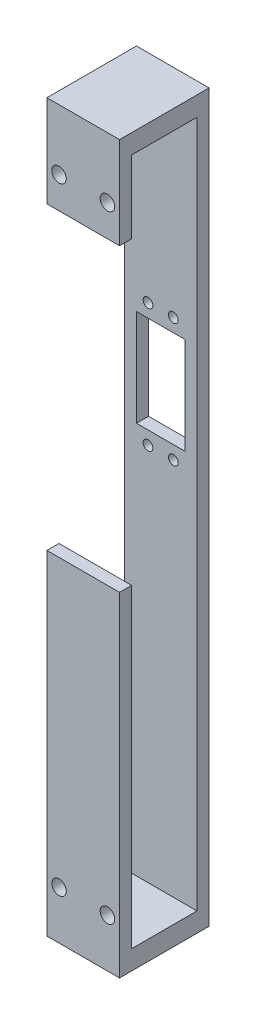
ISO-10303-21;
HEADER;
FILE_DESCRIPTION(('STEP AP214'),'2;1');
FILE_NAME('part.step','',(''),(''),'','','');
FILE_SCHEMA(('AUTOMOTIVE_DESIGN { 1 0 10303 214 1 1 1 1 }'));
ENDSEC;
DATA;
#1=APPLICATION_CONTEXT('core data for automotive mechanical design processes');
#2=APPLICATION_PROTOCOL_DEFINITION('international standard','automotive_design',2000,#1);
#3=PRODUCT_CONTEXT('',#1,'mechanical');
#4=PRODUCT('Part','Part','',(#3));
#5=PRODUCT_RELATED_PRODUCT_CATEGORY('part','',(#4));
#6=PRODUCT_DEFINITION_FORMATION('','',#4);
#7=PRODUCT_DEFINITION_CONTEXT('part definition',#1,'design');
#8=PRODUCT_DEFINITION('design','',#6,#7);
#9=PRODUCT_DEFINITION_SHAPE('','',#8);
#10=(LENGTH_UNIT() NAMED_UNIT(*) SI_UNIT(.MILLI.,.METRE.));
#11=(NAMED_UNIT(*) PLANE_ANGLE_UNIT() SI_UNIT($,.RADIAN.));
#12=(NAMED_UNIT(*) SI_UNIT($,.STERADIAN.) SOLID_ANGLE_UNIT());
#13=UNCERTAINTY_MEASURE_WITH_UNIT(LENGTH_MEASURE(1.E-05),#10,'distance_accuracy_value','');
#14=(GEOMETRIC_REPRESENTATION_CONTEXT(3) GLOBAL_UNCERTAINTY_ASSIGNED_CONTEXT((#13)) GLOBAL_UNIT_ASSIGNED_CONTEXT((#10,
#11,#12)) REPRESENTATION_CONTEXT('',''));
#15=CARTESIAN_POINT('',(0.,0.,0.));
#16=DIRECTION('',(0.,0.,1.));
#17=DIRECTION('',(1.,0.,0.));
#18=AXIS2_PLACEMENT_3D('',#15,#16,#17);
#19=CARTESIAN_POINT('',(0.,0.,37.));
#20=DIRECTION('',(0.,0.,1.));
#21=DIRECTION('',(1.,0.,0.));
#22=AXIS2_PLACEMENT_3D('',#19,#20,#21);
#23=PLANE('',#22);
#24=DIRECTION('',(0.,-1.,0.));
#25=VECTOR('',#24,1.);
#26=CARTESIAN_POINT('',(-4.99999999999999,-102.,37.));
#27=LINE('',#26,#25);
#28=CARTESIAN_POINT('',(-4.99999999999998,-72.,37.));
#29=VERTEX_POINT('',#28);
#30=CARTESIAN_POINT('',(-5.,-210.,37.));
#31=VERTEX_POINT('',#30);
#32=EDGE_CURVE('E257',#29,#31,#27,.T.);
#33=ORIENTED_EDGE('',*,*,#32,.T.);
#34=DIRECTION('',(-1.,0.,0.));
#35=VECTOR('',#34,1.);
#36=CARTESIAN_POINT('',(25.,-210.,37.));
#37=LINE('',#36,#35);
#38=CARTESIAN_POINT('',(25.,-210.,37.));
#39=VERTEX_POINT('',#38);
#40=EDGE_CURVE('E209',#39,#31,#37,.T.);
#41=ORIENTED_EDGE('',*,*,#40,.F.);
#42=DIRECTION('',(0.,1.,0.));
#43=VECTOR('',#42,1.);
#44=CARTESIAN_POINT('',(25.,-110.,37.));
#45=LINE('',#44,#43);
#46=CARTESIAN_POINT('',(25.,-72.,37.));
#47=VERTEX_POINT('',#46);
#48=EDGE_CURVE('E255',#39,#47,#45,.T.);
#49=ORIENTED_EDGE('',*,*,#48,.T.);
#50=DIRECTION('',(1.,0.,0.));
#51=VECTOR('',#50,1.);
#52=CARTESIAN_POINT('',(0.,-72.,37.));
#53=LINE('',#52,#51);
#54=EDGE_CURVE('E171',#29,#47,#53,.T.);
#55=ORIENTED_EDGE('',*,*,#54,.F.);
#56=EDGE_LOOP('',(#33,#41,#49,#55));
#57=FACE_BOUND('',#56,.T.);
#58=CARTESIAN_POINT('',(20.,-190.,37.));
#59=DIRECTION('',(0.,0.,1.));
#60=DIRECTION('',(1.,0.,0.));
#61=AXIS2_PLACEMENT_3D('',#58,#59,#60);
#62=CIRCLE('',#61,3.);
#63=CARTESIAN_POINT('',(23.,-190.,37.));
#64=VERTEX_POINT('',#63);
#65=EDGE_CURVE('E190',#64,#64,#62,.T.);
#66=ORIENTED_EDGE('',*,*,#65,.F.);
#67=EDGE_LOOP('',(#66));
#68=FACE_BOUND('',#67,.T.);
#69=CARTESIAN_POINT('',(0.,-190.,37.));
#70=DIRECTION('',(0.,0.,1.));
#71=DIRECTION('',(1.,0.,0.));
#72=AXIS2_PLACEMENT_3D('',#69,#70,#71);
#73=CIRCLE('',#72,3.);
#74=CARTESIAN_POINT('',(3.,-190.,37.));
#75=VERTEX_POINT('',#74);
#76=EDGE_CURVE('E326',#75,#75,#73,.F.);
#77=ORIENTED_EDGE('',*,*,#76,.T.);
#78=EDGE_LOOP('',(#77));
#79=FACE_BOUND('',#78,.T.);
#80=ADVANCED_FACE('F44',(#57,#68,#79),#23,.T.);
#81=CARTESIAN_POINT('',(0.,-72.,32.));
#82=DIRECTION('',(0.,0.,1.));
#83=DIRECTION('',(1.,0.,0.));
#84=AXIS2_PLACEMENT_3D('',#81,#82,#83);
#85=PLANE('',#84);
#86=CARTESIAN_POINT('',(20.,-190.,32.));
#87=DIRECTION('',(0.,0.,1.));
#88=DIRECTION('',(1.,0.,0.));
#89=AXIS2_PLACEMENT_3D('',#86,#87,#88);
#90=CIRCLE('',#89,3.);
#91=CARTESIAN_POINT('',(23.,-190.,32.));
#92=VERTEX_POINT('',#91);
#93=EDGE_CURVE('E324',#92,#92,#90,.T.);
#94=ORIENTED_EDGE('',*,*,#93,.T.);
#95=EDGE_LOOP('',(#94));
#96=FACE_BOUND('',#95,.T.);
#97=DIRECTION('',(0.,-1.,0.));
#98=VECTOR('',#97,1.);
#99=CARTESIAN_POINT('',(25.,-72.,32.));
#100=LINE('',#99,#98);
#101=CARTESIAN_POINT('',(25.,-72.,32.));
#102=VERTEX_POINT('',#101);
#103=CARTESIAN_POINT('',(25.,-202.,32.));
#104=VERTEX_POINT('',#103);
#105=EDGE_CURVE('E170',#102,#104,#100,.T.);
#106=ORIENTED_EDGE('',*,*,#105,.T.);
#107=DIRECTION('',(1.,0.,0.));
#108=VECTOR('',#107,1.);
#109=CARTESIAN_POINT('',(-5.,-202.,32.));
#110=LINE('',#109,#108);
#111=CARTESIAN_POINT('',(-5.,-202.,32.));
#112=VERTEX_POINT('',#111);
#113=EDGE_CURVE('E174',#112,#104,#110,.T.);
#114=ORIENTED_EDGE('',*,*,#113,.F.);
#115=DIRECTION('',(0.,-1.,0.));
#116=VECTOR('',#115,1.);
#117=CARTESIAN_POINT('',(-4.99999999999999,-72.,32.));
#118=LINE('',#117,#116);
#119=CARTESIAN_POINT('',(-4.99999999999999,-72.,32.));
#120=VERTEX_POINT('',#119);
#121=EDGE_CURVE('E162',#120,#112,#118,.T.);
#122=ORIENTED_EDGE('',*,*,#121,.F.);
#123=DIRECTION('',(-1.,0.,0.));
#124=VECTOR('',#123,1.);
#125=CARTESIAN_POINT('',(0.,-72.,32.));
#126=LINE('',#125,#124);
#127=EDGE_CURVE('E234',#102,#120,#126,.T.);
#128=ORIENTED_EDGE('',*,*,#127,.F.);
#129=EDGE_LOOP('',(#106,#114,#122,#128));
#130=FACE_BOUND('',#129,.T.);
#131=CARTESIAN_POINT('',(0.,-190.,32.));
#132=DIRECTION('',(0.,0.,1.));
#133=DIRECTION('',(1.,0.,0.));
#134=AXIS2_PLACEMENT_3D('',#131,#132,#133);
#135=CIRCLE('',#134,3.);
#136=CARTESIAN_POINT('',(3.,-190.,32.));
#137=VERTEX_POINT('',#136);
#138=EDGE_CURVE('E48',#137,#137,#135,.F.);
#139=ORIENTED_EDGE('',*,*,#138,.F.);
#140=EDGE_LOOP('',(#139));
#141=FACE_BOUND('',#140,.T.);
#142=ADVANCED_FACE('F175',(#96,#130,#141),#85,.F.);
#143=CARTESIAN_POINT('',(0.,0.,37.));
#144=DIRECTION('',(0.,0.,1.));
#145=DIRECTION('',(1.,0.,0.));
#146=AXIS2_PLACEMENT_3D('',#143,#144,#145);
#147=PLANE('',#146);
#148=CARTESIAN_POINT('',(0.,65.,37.));
#149=DIRECTION('',(0.,0.,1.));
#150=DIRECTION('',(1.,0.,0.));
#151=AXIS2_PLACEMENT_3D('',#148,#149,#150);
#152=CIRCLE('',#151,3.);
#153=CARTESIAN_POINT('',(3.00000000000001,65.,37.));
#154=VERTEX_POINT('',#153);
#155=EDGE_CURVE('E195',#154,#154,#152,.F.);
#156=ORIENTED_EDGE('',*,*,#155,.T.);
#157=EDGE_LOOP('',(#156));
#158=FACE_BOUND('',#157,.T.);
#159=DIRECTION('',(0.,1.,0.));
#160=VECTOR('',#159,1.);
#161=CARTESIAN_POINT('',(25.,82.,37.));
#162=LINE('',#161,#160);
#163=CARTESIAN_POINT('',(25.,52.,37.));
#164=VERTEX_POINT('',#163);
#165=CARTESIAN_POINT('',(25.,90.,37.));
#166=VERTEX_POINT('',#165);
#167=EDGE_CURVE('E241',#164,#166,#162,.T.);
#168=ORIENTED_EDGE('',*,*,#167,.T.);
#169=DIRECTION('',(-1.,0.,0.));
#170=VECTOR('',#169,1.);
#171=CARTESIAN_POINT('',(25.,90.,37.));
#172=LINE('',#171,#170);
#173=CARTESIAN_POINT('',(-5.,90.,37.));
#174=VERTEX_POINT('',#173);
#175=EDGE_CURVE('E244',#166,#174,#172,.T.);
#176=ORIENTED_EDGE('',*,*,#175,.T.);
#177=DIRECTION('',(0.,-1.,0.));
#178=VECTOR('',#177,1.);
#179=CARTESIAN_POINT('',(-5.,90.,37.));
#180=LINE('',#179,#178);
#181=CARTESIAN_POINT('',(-4.99999999999999,52.,37.));
#182=VERTEX_POINT('',#181);
#183=EDGE_CURVE('E247',#174,#182,#180,.T.);
#184=ORIENTED_EDGE('',*,*,#183,.T.);
#185=DIRECTION('',(-1.,0.,0.));
#186=VECTOR('',#185,1.);
#187=CARTESIAN_POINT('',(-4.99999999999999,52.,37.));
#188=LINE('',#187,#186);
#189=EDGE_CURVE('E215',#164,#182,#188,.T.);
#190=ORIENTED_EDGE('',*,*,#189,.F.);
#191=EDGE_LOOP('',(#168,#176,#184,#190));
#192=FACE_BOUND('',#191,.T.);
#193=CARTESIAN_POINT('',(20.,65.,37.));
#194=DIRECTION('',(0.,0.,1.));
#195=DIRECTION('',(1.,0.,0.));
#196=AXIS2_PLACEMENT_3D('',#193,#194,#195);
#197=CIRCLE('',#196,3.);
#198=CARTESIAN_POINT('',(23.,65.,37.));
#199=VERTEX_POINT('',#198);
#200=EDGE_CURVE('E199',#199,#199,#197,.T.);
#201=ORIENTED_EDGE('',*,*,#200,.F.);
#202=EDGE_LOOP('',(#201));
#203=FACE_BOUND('',#202,.T.);
#204=ADVANCED_FACE('F345',(#158,#192,#203),#147,.T.);
#205=CARTESIAN_POINT('',(25.,52.,32.));
#206=DIRECTION('',(0.,0.,1.));
#207=DIRECTION('',(1.,0.,0.));
#208=AXIS2_PLACEMENT_3D('',#205,#206,#207);
#209=PLANE('',#208);
#210=DIRECTION('',(1.,0.,0.));
#211=VECTOR('',#210,1.);
#212=CARTESIAN_POINT('',(25.,82.,32.));
#213=LINE('',#212,#211);
#214=CARTESIAN_POINT('',(-4.99999999999999,82.,32.));
#215=VERTEX_POINT('',#214);
#216=CARTESIAN_POINT('',(25.,82.,32.));
#217=VERTEX_POINT('',#216);
#218=EDGE_CURVE('E212',#215,#217,#213,.T.);
#219=ORIENTED_EDGE('',*,*,#218,.T.);
#220=DIRECTION('',(0.,1.,0.));
#221=VECTOR('',#220,1.);
#222=CARTESIAN_POINT('',(25.,52.,32.));
#223=LINE('',#222,#221);
#224=CARTESIAN_POINT('',(25.,52.,32.));
#225=VERTEX_POINT('',#224);
#226=EDGE_CURVE('E225',#225,#217,#223,.T.);
#227=ORIENTED_EDGE('',*,*,#226,.F.);
#228=DIRECTION('',(1.,0.,0.));
#229=VECTOR('',#228,1.);
#230=CARTESIAN_POINT('',(25.,52.,32.));
#231=LINE('',#230,#229);
#232=CARTESIAN_POINT('',(-4.99999999999999,52.,32.));
#233=VERTEX_POINT('',#232);
#234=EDGE_CURVE('E220',#233,#225,#231,.T.);
#235=ORIENTED_EDGE('',*,*,#234,.F.);
#236=DIRECTION('',(0.,1.,0.));
#237=VECTOR('',#236,1.);
#238=CARTESIAN_POINT('',(-4.99999999999999,52.,32.));
#239=LINE('',#238,#237);
#240=EDGE_CURVE('E229',#233,#215,#239,.T.);
#241=ORIENTED_EDGE('',*,*,#240,.T.);
#242=EDGE_LOOP('',(#219,#227,#235,#241));
#243=FACE_BOUND('',#242,.T.);
#244=CARTESIAN_POINT('',(0.,65.,32.));
#245=DIRECTION('',(0.,0.,1.));
#246=DIRECTION('',(1.,0.,0.));
#247=AXIS2_PLACEMENT_3D('',#244,#245,#246);
#248=CIRCLE('',#247,3.);
#249=CARTESIAN_POINT('',(3.00000000000001,65.,32.));
#250=VERTEX_POINT('',#249);
#251=EDGE_CURVE('E193',#250,#250,#248,.F.);
#252=ORIENTED_EDGE('',*,*,#251,.F.);
#253=EDGE_LOOP('',(#252));
#254=FACE_BOUND('',#253,.T.);
#255=CARTESIAN_POINT('',(20.,65.,32.));
#256=DIRECTION('',(0.,0.,1.));
#257=DIRECTION('',(1.,0.,0.));
#258=AXIS2_PLACEMENT_3D('',#255,#256,#257);
#259=CIRCLE('',#258,3.);
#260=CARTESIAN_POINT('',(23.,65.,32.));
#261=VERTEX_POINT('',#260);
#262=EDGE_CURVE('E198',#261,#261,#259,.T.);
#263=ORIENTED_EDGE('',*,*,#262,.T.);
#264=EDGE_LOOP('',(#263));
#265=FACE_BOUND('',#264,.T.);
#266=ADVANCED_FACE('F410',(#243,#254,#265),#209,.F.);
#267=CARTESIAN_POINT('',(-5.,82.,37.));
#268=DIRECTION('',(0.,1.,0.));
#269=DIRECTION('',(0.,0.,1.));
#270=AXIS2_PLACEMENT_3D('',#267,#268,#269);
#271=PLANE('',#270);
#272=ORIENTED_EDGE('',*,*,#218,.F.);
#273=DIRECTION('',(0.,0.,-1.));
#274=VECTOR('',#273,1.);
#275=CARTESIAN_POINT('',(-5.,82.,37.));
#276=LINE('',#275,#274);
#277=CARTESIAN_POINT('',(-5.,82.,5.));
#278=VERTEX_POINT('',#277);
#279=EDGE_CURVE('E253',#215,#278,#276,.T.);
#280=ORIENTED_EDGE('',*,*,#279,.T.);
#281=DIRECTION('',(1.,0.,0.));
#282=VECTOR('',#281,1.);
#283=CARTESIAN_POINT('',(-5.,82.,5.));
#284=LINE('',#283,#282);
#285=CARTESIAN_POINT('',(25.,82.,5.));
#286=VERTEX_POINT('',#285);
#287=EDGE_CURVE('E240',#278,#286,#284,.T.);
#288=ORIENTED_EDGE('',*,*,#287,.T.);
#289=DIRECTION('',(0.,0.,-1.));
#290=VECTOR('',#289,1.);
#291=CARTESIAN_POINT('',(25.,82.,37.));
#292=LINE('',#291,#290);
#293=EDGE_CURVE('E249',#217,#286,#292,.T.);
#294=ORIENTED_EDGE('',*,*,#293,.F.);
#295=EDGE_LOOP('',(#272,#280,#288,#294));
#296=FACE_BOUND('',#295,.T.);
#297=ADVANCED_FACE('F349',(#296),#271,.F.);
#298=CARTESIAN_POINT('',(0.,0.,5.));
#299=DIRECTION('',(0.,0.,-1.));
#300=DIRECTION('',(-1.,0.,0.));
#301=AXIS2_PLACEMENT_3D('',#298,#299,#300);
#302=PLANE('',#301);
#303=ORIENTED_EDGE('',*,*,#287,.F.);
#304=DIRECTION('',(0.,-1.,0.));
#305=VECTOR('',#304,1.);
#306=CARTESIAN_POINT('',(-5.,-50.,5.));
#307=LINE('',#306,#305);
#308=CARTESIAN_POINT('',(-5.,-202.,4.99999999999999));
#309=VERTEX_POINT('',#308);
#310=EDGE_CURVE('E53',#278,#309,#307,.T.);
#311=ORIENTED_EDGE('',*,*,#310,.T.);
#312=DIRECTION('',(1.,0.,0.));
#313=VECTOR('',#312,1.);
#314=CARTESIAN_POINT('',(-5.,-202.,4.99999999999999));
#315=LINE('',#314,#313);
#316=CARTESIAN_POINT('',(25.,-202.,4.99999999999999));
#317=VERTEX_POINT('',#316);
#318=EDGE_CURVE('E181',#309,#317,#315,.T.);
#319=ORIENTED_EDGE('',*,*,#318,.T.);
#320=DIRECTION('',(0.,1.,0.));
#321=VECTOR('',#320,1.);
#322=CARTESIAN_POINT('',(25.,10.,5.));
#323=LINE('',#322,#321);
#324=EDGE_CURVE('E12',#317,#286,#323,.T.);
#325=ORIENTED_EDGE('',*,*,#324,.T.);
#326=EDGE_LOOP('',(#303,#311,#319,#325));
#327=FACE_BOUND('',#326,.T.);
#328=CARTESIAN_POINT('',(4.74999999999999,-45.5,5.));
#329=DIRECTION('',(0.,0.,1.));
#330=DIRECTION('',(1.,0.,0.));
#331=AXIS2_PLACEMENT_3D('',#328,#329,#330);
#332=CIRCLE('',#331,1.99999999999994);
#333=CARTESIAN_POINT('',(6.74999999999993,-45.5,5.));
#334=VERTEX_POINT('',#333);
#335=EDGE_CURVE('E267',#334,#334,#332,.T.);
#336=ORIENTED_EDGE('',*,*,#335,.F.);
#337=EDGE_LOOP('',(#336));
#338=FACE_BOUND('',#337,.T.);
#339=CARTESIAN_POINT('',(15.25,-45.5,5.));
#340=DIRECTION('',(0.,0.,1.));
#341=DIRECTION('',(1.,0.,0.));
#342=AXIS2_PLACEMENT_3D('',#339,#340,#341);
#343=CIRCLE('',#342,1.99999999999994);
#344=CARTESIAN_POINT('',(17.2499999999999,-45.5,5.));
#345=VERTEX_POINT('',#344);
#346=EDGE_CURVE('E278',#345,#345,#343,.F.);
#347=ORIENTED_EDGE('',*,*,#346,.T.);
#348=EDGE_LOOP('',(#347));
#349=FACE_BOUND('',#348,.T.);
#350=DIRECTION('',(0.,-1.,0.));
#351=VECTOR('',#350,1.);
#352=CARTESIAN_POINT('',(0.,0.,5.));
#353=LINE('',#352,#351);
#354=CARTESIAN_POINT('',(0.,0.,5.));
#355=VERTEX_POINT('',#354);
#356=CARTESIAN_POINT('',(0.,-40.,5.));
#357=VERTEX_POINT('',#356);
#358=EDGE_CURVE('E291',#355,#357,#353,.T.);
#359=ORIENTED_EDGE('',*,*,#358,.F.);
#360=DIRECTION('',(-1.,0.,0.));
#361=VECTOR('',#360,1.);
#362=CARTESIAN_POINT('',(0.,0.,5.));
#363=LINE('',#362,#361);
#364=CARTESIAN_POINT('',(20.,0.,5.));
#365=VERTEX_POINT('',#364);
#366=EDGE_CURVE('E298',#365,#355,#363,.T.);
#367=ORIENTED_EDGE('',*,*,#366,.F.);
#368=DIRECTION('',(0.,1.,0.));
#369=VECTOR('',#368,1.);
#370=CARTESIAN_POINT('',(20.,0.,5.));
#371=LINE('',#370,#369);
#372=CARTESIAN_POINT('',(20.,-40.,5.));
#373=VERTEX_POINT('',#372);
#374=EDGE_CURVE('E296',#373,#365,#371,.T.);
#375=ORIENTED_EDGE('',*,*,#374,.F.);
#376=DIRECTION('',(1.,0.,0.));
#377=VECTOR('',#376,1.);
#378=CARTESIAN_POINT('',(0.,-40.,5.));
#379=LINE('',#378,#377);
#380=EDGE_CURVE('E293',#357,#373,#379,.T.);
#381=ORIENTED_EDGE('',*,*,#380,.F.);
#382=EDGE_LOOP('',(#359,#367,#375,#381));
#383=FACE_BOUND('',#382,.T.);
#384=CARTESIAN_POINT('',(4.75,5.5,5.));
#385=DIRECTION('',(0.,0.,1.));
#386=DIRECTION('',(1.,0.,0.));
#387=AXIS2_PLACEMENT_3D('',#384,#385,#386);
#388=CIRCLE('',#387,2.);
#389=CARTESIAN_POINT('',(6.75,5.5,5.));
#390=VERTEX_POINT('',#389);
#391=EDGE_CURVE('E271',#390,#390,#388,.F.);
#392=ORIENTED_EDGE('',*,*,#391,.T.);
#393=EDGE_LOOP('',(#392));
#394=FACE_BOUND('',#393,.T.);
#395=CARTESIAN_POINT('',(15.25,5.49999999999999,5.));
#396=DIRECTION('',(0.,0.,1.));
#397=DIRECTION('',(1.,0.,0.));
#398=AXIS2_PLACEMENT_3D('',#395,#396,#397);
#399=CIRCLE('',#398,2.);
#400=CARTESIAN_POINT('',(17.25,5.49999999999999,5.));
#401=VERTEX_POINT('',#400);
#402=EDGE_CURVE('E272',#401,#401,#399,.T.);
#403=ORIENTED_EDGE('',*,*,#402,.F.);
#404=EDGE_LOOP('',(#403));
#405=FACE_BOUND('',#404,.T.);
#406=ADVANCED_FACE('F387',(#327,#338,#349,#383,#394,#405),#302,.F.);
#407=CARTESIAN_POINT('',(-5.,-50.,5.));
#408=DIRECTION('',(1.,0.,0.));
#409=DIRECTION('',(0.,0.,-1.));
#410=AXIS2_PLACEMENT_3D('',#407,#408,#409);
#411=PLANE('',#410);
#412=DIRECTION('',(0.,0.,-1.));
#413=VECTOR('',#412,1.);
#414=CARTESIAN_POINT('',(-5.,-202.,4.99999999999999));
#415=LINE('',#414,#413);
#416=EDGE_CURVE('E166',#112,#309,#415,.T.);
#417=ORIENTED_EDGE('',*,*,#416,.T.);
#418=ORIENTED_EDGE('',*,*,#310,.F.);
#419=ORIENTED_EDGE('',*,*,#279,.F.);
#420=ORIENTED_EDGE('',*,*,#240,.F.);
#421=DIRECTION('',(0.,0.,-1.));
#422=VECTOR('',#421,1.);
#423=CARTESIAN_POINT('',(-4.99999999999999,52.,37.));
#424=LINE('',#423,#422);
#425=EDGE_CURVE('E218',#182,#233,#424,.T.);
#426=ORIENTED_EDGE('',*,*,#425,.F.);
#427=ORIENTED_EDGE('',*,*,#183,.F.);
#428=DIRECTION('',(0.,0.,1.));
#429=VECTOR('',#428,1.);
#430=CARTESIAN_POINT('',(-5.,90.,0.));
#431=LINE('',#430,#429);
#432=CARTESIAN_POINT('',(-5.,90.,0.));
#433=VERTEX_POINT('',#432);
#434=EDGE_CURVE('E262',#433,#174,#431,.T.);
#435=ORIENTED_EDGE('',*,*,#434,.F.);
#436=DIRECTION('',(0.,-1.,0.));
#437=VECTOR('',#436,1.);
#438=CARTESIAN_POINT('',(-5.,-50.,0.));
#439=LINE('',#438,#437);
#440=CARTESIAN_POINT('',(-5.,-210.,0.));
#441=VERTEX_POINT('',#440);
#442=EDGE_CURVE('E316',#433,#441,#439,.T.);
#443=ORIENTED_EDGE('',*,*,#442,.T.);
#444=DIRECTION('',(0.,0.,1.));
#445=VECTOR('',#444,1.);
#446=CARTESIAN_POINT('',(-5.,-210.,0.));
#447=LINE('',#446,#445);
#448=EDGE_CURVE('E202',#441,#31,#447,.T.);
#449=ORIENTED_EDGE('',*,*,#448,.T.);
#450=ORIENTED_EDGE('',*,*,#32,.F.);
#451=DIRECTION('',(0.,0.,1.));
#452=VECTOR('',#451,1.);
#453=CARTESIAN_POINT('',(-4.99999999999999,-72.,0.));
#454=LINE('',#453,#452);
#455=EDGE_CURVE('E168',#120,#29,#454,.T.);
#456=ORIENTED_EDGE('',*,*,#455,.F.);
#457=ORIENTED_EDGE('',*,*,#121,.T.);
#458=EDGE_LOOP('',(#417,#418,#419,#420,#426,#427,#435,#443,#449,#450,#456,#457));
#459=FACE_BOUND('',#458,.T.);
#460=ADVANCED_FACE('F46',(#459),#411,.F.);
#461=CARTESIAN_POINT('',(25.,10.,5.));
#462=DIRECTION('',(-1.,0.,0.));
#463=DIRECTION('',(0.,0.,1.));
#464=AXIS2_PLACEMENT_3D('',#461,#462,#463);
#465=PLANE('',#464);
#466=ORIENTED_EDGE('',*,*,#324,.F.);
#467=DIRECTION('',(0.,0.,-1.));
#468=VECTOR('',#467,1.);
#469=CARTESIAN_POINT('',(25.,-202.,4.99999999999999));
#470=LINE('',#469,#468);
#471=EDGE_CURVE('E186',#104,#317,#470,.T.);
#472=ORIENTED_EDGE('',*,*,#471,.F.);
#473=ORIENTED_EDGE('',*,*,#105,.F.);
#474=DIRECTION('',(0.,0.,-1.));
#475=VECTOR('',#474,1.);
#476=CARTESIAN_POINT('',(25.,-72.,0.));
#477=LINE('',#476,#475);
#478=EDGE_CURVE('E231',#47,#102,#477,.T.);
#479=ORIENTED_EDGE('',*,*,#478,.F.);
#480=ORIENTED_EDGE('',*,*,#48,.F.);
#481=DIRECTION('',(0.,0.,1.));
#482=VECTOR('',#481,1.);
#483=CARTESIAN_POINT('',(25.,-210.,0.));
#484=LINE('',#483,#482);
#485=CARTESIAN_POINT('',(25.,-210.,0.));
#486=VERTEX_POINT('',#485);
#487=EDGE_CURVE('E203',#486,#39,#484,.T.);
#488=ORIENTED_EDGE('',*,*,#487,.F.);
#489=DIRECTION('',(0.,1.,0.));
#490=VECTOR('',#489,1.);
#491=CARTESIAN_POINT('',(25.,10.,0.));
#492=LINE('',#491,#490);
#493=CARTESIAN_POINT('',(25.,90.,0.));
#494=VERTEX_POINT('',#493);
#495=EDGE_CURVE('E317',#486,#494,#492,.T.);
#496=ORIENTED_EDGE('',*,*,#495,.T.);
#497=DIRECTION('',(0.,0.,-1.));
#498=VECTOR('',#497,1.);
#499=CARTESIAN_POINT('',(25.,90.,5.));
#500=LINE('',#499,#498);
#501=EDGE_CURVE('E264',#166,#494,#500,.T.);
#502=ORIENTED_EDGE('',*,*,#501,.F.);
#503=ORIENTED_EDGE('',*,*,#167,.F.);
#504=DIRECTION('',(0.,0.,1.));
#505=VECTOR('',#504,1.);
#506=CARTESIAN_POINT('',(25.,52.,37.));
#507=LINE('',#506,#505);
#508=EDGE_CURVE('E222',#225,#164,#507,.T.);
#509=ORIENTED_EDGE('',*,*,#508,.F.);
#510=ORIENTED_EDGE('',*,*,#226,.T.);
#511=ORIENTED_EDGE('',*,*,#293,.T.);
#512=EDGE_LOOP('',(#466,#472,#473,#479,#480,#488,#496,#502,#503,#509,#510,#511));
#513=FACE_BOUND('',#512,.T.);
#514=ADVANCED_FACE('F392',(#513),#465,.F.);
#515=CARTESIAN_POINT('',(0.,0.,0.));
#516=DIRECTION('',(0.,0.,-1.));
#517=DIRECTION('',(-1.,0.,0.));
#518=AXIS2_PLACEMENT_3D('',#515,#516,#517);
#519=PLANE('',#518);
#520=ORIENTED_EDGE('',*,*,#442,.F.);
#521=DIRECTION('',(-1.,0.,0.));
#522=VECTOR('',#521,1.);
#523=CARTESIAN_POINT('',(25.,90.,0.));
#524=LINE('',#523,#522);
#525=EDGE_CURVE('E259',#494,#433,#524,.T.);
#526=ORIENTED_EDGE('',*,*,#525,.F.);
#527=ORIENTED_EDGE('',*,*,#495,.F.);
#528=DIRECTION('',(-1.,0.,0.));
#529=VECTOR('',#528,1.);
#530=CARTESIAN_POINT('',(25.,-210.,0.));
#531=LINE('',#530,#529);
#532=EDGE_CURVE('E206',#486,#441,#531,.T.);
#533=ORIENTED_EDGE('',*,*,#532,.T.);
#534=EDGE_LOOP('',(#520,#526,#527,#533));
#535=FACE_BOUND('',#534,.T.);
#536=CARTESIAN_POINT('',(15.25,-45.5,0.));
#537=DIRECTION('',(0.,0.,1.));
#538=DIRECTION('',(1.,0.,0.));
#539=AXIS2_PLACEMENT_3D('',#536,#537,#538);
#540=CIRCLE('',#539,1.99999999999994);
#541=CARTESIAN_POINT('',(17.2499999999999,-45.5,0.));
#542=VERTEX_POINT('',#541);
#543=EDGE_CURVE('E275',#542,#542,#540,.F.);
#544=ORIENTED_EDGE('',*,*,#543,.F.);
#545=EDGE_LOOP('',(#544));
#546=FACE_BOUND('',#545,.T.);
#547=CARTESIAN_POINT('',(4.75,5.5,0.));
#548=DIRECTION('',(0.,0.,1.));
#549=DIRECTION('',(1.,0.,0.));
#550=AXIS2_PLACEMENT_3D('',#547,#548,#549);
#551=CIRCLE('',#550,2.);
#552=CARTESIAN_POINT('',(6.75,5.5,0.));
#553=VERTEX_POINT('',#552);
#554=EDGE_CURVE('E286',#553,#553,#551,.F.);
#555=ORIENTED_EDGE('',*,*,#554,.F.);
#556=EDGE_LOOP('',(#555));
#557=FACE_BOUND('',#556,.T.);
#558=DIRECTION('',(-1.,0.,0.));
#559=VECTOR('',#558,1.);
#560=CARTESIAN_POINT('',(0.,0.,0.));
#561=LINE('',#560,#559);
#562=CARTESIAN_POINT('',(20.,0.,0.));
#563=VERTEX_POINT('',#562);
#564=CARTESIAN_POINT('',(0.,0.,0.));
#565=VERTEX_POINT('',#564);
#566=EDGE_CURVE('E294',#563,#565,#561,.T.);
#567=ORIENTED_EDGE('',*,*,#566,.T.);
#568=DIRECTION('',(0.,-1.,0.));
#569=VECTOR('',#568,1.);
#570=CARTESIAN_POINT('',(0.,0.,0.));
#571=LINE('',#570,#569);
#572=CARTESIAN_POINT('',(0.,-40.,0.));
#573=VERTEX_POINT('',#572);
#574=EDGE_CURVE('E69',#565,#573,#571,.T.);
#575=ORIENTED_EDGE('',*,*,#574,.T.);
#576=DIRECTION('',(1.,0.,0.));
#577=VECTOR('',#576,1.);
#578=CARTESIAN_POINT('',(0.,-40.,0.));
#579=LINE('',#578,#577);
#580=CARTESIAN_POINT('',(20.,-40.,0.));
#581=VERTEX_POINT('',#580);
#582=EDGE_CURVE('E302',#573,#581,#579,.T.);
#583=ORIENTED_EDGE('',*,*,#582,.T.);
#584=DIRECTION('',(0.,1.,0.));
#585=VECTOR('',#584,1.);
#586=CARTESIAN_POINT('',(20.,0.,0.));
#587=LINE('',#586,#585);
#588=EDGE_CURVE('E305',#581,#563,#587,.T.);
#589=ORIENTED_EDGE('',*,*,#588,.T.);
#590=EDGE_LOOP('',(#567,#575,#583,#589));
#591=FACE_BOUND('',#590,.T.);
#592=CARTESIAN_POINT('',(15.25,5.49999999999999,0.));
#593=DIRECTION('',(0.,0.,1.));
#594=DIRECTION('',(1.,0.,0.));
#595=AXIS2_PLACEMENT_3D('',#592,#593,#594);
#596=CIRCLE('',#595,2.);
#597=CARTESIAN_POINT('',(17.25,5.49999999999999,0.));
#598=VERTEX_POINT('',#597);
#599=EDGE_CURVE('E268',#598,#598,#596,.T.);
#600=ORIENTED_EDGE('',*,*,#599,.T.);
#601=EDGE_LOOP('',(#600));
#602=FACE_BOUND('',#601,.T.);
#603=CARTESIAN_POINT('',(4.74999999999999,-45.5,0.));
#604=DIRECTION('',(0.,0.,1.));
#605=DIRECTION('',(1.,0.,0.));
#606=AXIS2_PLACEMENT_3D('',#603,#604,#605);
#607=CIRCLE('',#606,1.99999999999994);
#608=CARTESIAN_POINT('',(6.74999999999993,-45.5,0.));
#609=VERTEX_POINT('',#608);
#610=EDGE_CURVE('E281',#609,#609,#607,.T.);
#611=ORIENTED_EDGE('',*,*,#610,.T.);
#612=EDGE_LOOP('',(#611));
#613=FACE_BOUND('',#612,.T.);
#614=ADVANCED_FACE('F386',(#535,#546,#557,#591,#602,#613),#519,.T.);
#615=CARTESIAN_POINT('',(0.,0.,5.));
#616=DIRECTION('',(1.,0.,0.));
#617=DIRECTION('',(0.,1.,0.));
#618=AXIS2_PLACEMENT_3D('',#615,#616,#617);
#619=PLANE('',#618);
#620=ORIENTED_EDGE('',*,*,#574,.F.);
#621=DIRECTION('',(0.,0.,-1.));
#622=VECTOR('',#621,1.);
#623=CARTESIAN_POINT('',(0.,0.,5.));
#624=LINE('',#623,#622);
#625=EDGE_CURVE('E300',#355,#565,#624,.T.);
#626=ORIENTED_EDGE('',*,*,#625,.F.);
#627=ORIENTED_EDGE('',*,*,#358,.T.);
#628=DIRECTION('',(0.,0.,-1.));
#629=VECTOR('',#628,1.);
#630=CARTESIAN_POINT('',(0.,-40.,5.));
#631=LINE('',#630,#629);
#632=EDGE_CURVE('E314',#357,#573,#631,.T.);
#633=ORIENTED_EDGE('',*,*,#632,.T.);
#634=EDGE_LOOP('',(#620,#626,#627,#633));
#635=FACE_BOUND('',#634,.T.);
#636=ADVANCED_FACE('F382',(#635),#619,.T.);
#637=CARTESIAN_POINT('',(0.,-40.,5.));
#638=DIRECTION('',(0.,1.,0.));
#639=DIRECTION('',(0.,0.,1.));
#640=AXIS2_PLACEMENT_3D('',#637,#638,#639);
#641=PLANE('',#640);
#642=ORIENTED_EDGE('',*,*,#582,.F.);
#643=ORIENTED_EDGE('',*,*,#632,.F.);
#644=ORIENTED_EDGE('',*,*,#380,.T.);
#645=DIRECTION('',(0.,0.,-1.));
#646=VECTOR('',#645,1.);
#647=CARTESIAN_POINT('',(20.,-40.,5.));
#648=LINE('',#647,#646);
#649=EDGE_CURVE('E312',#373,#581,#648,.T.);
#650=ORIENTED_EDGE('',*,*,#649,.T.);
#651=EDGE_LOOP('',(#642,#643,#644,#650));
#652=FACE_BOUND('',#651,.T.);
#653=ADVANCED_FACE('F378',(#652),#641,.T.);
#654=CARTESIAN_POINT('',(20.,0.,5.));
#655=DIRECTION('',(-1.,0.,0.));
#656=DIRECTION('',(0.,-1.,0.));
#657=AXIS2_PLACEMENT_3D('',#654,#655,#656);
#658=PLANE('',#657);
#659=ORIENTED_EDGE('',*,*,#588,.F.);
#660=ORIENTED_EDGE('',*,*,#649,.F.);
#661=ORIENTED_EDGE('',*,*,#374,.T.);
#662=DIRECTION('',(0.,0.,-1.));
#663=VECTOR('',#662,1.);
#664=CARTESIAN_POINT('',(20.,0.,5.));
#665=LINE('',#664,#663);
#666=EDGE_CURVE('E61',#365,#563,#665,.T.);
#667=ORIENTED_EDGE('',*,*,#666,.T.);
#668=EDGE_LOOP('',(#659,#660,#661,#667));
#669=FACE_BOUND('',#668,.T.);
#670=ADVANCED_FACE('F375',(#669),#658,.T.);
#671=CARTESIAN_POINT('',(0.,0.,5.));
#672=DIRECTION('',(0.,-1.,0.));
#673=DIRECTION('',(0.,0.,-1.));
#674=AXIS2_PLACEMENT_3D('',#671,#672,#673);
#675=PLANE('',#674);
#676=ORIENTED_EDGE('',*,*,#566,.F.);
#677=ORIENTED_EDGE('',*,*,#666,.F.);
#678=ORIENTED_EDGE('',*,*,#366,.T.);
#679=ORIENTED_EDGE('',*,*,#625,.T.);
#680=EDGE_LOOP('',(#676,#677,#678,#679));
#681=FACE_BOUND('',#680,.T.);
#682=ADVANCED_FACE('F371',(#681),#675,.T.);
#683=CARTESIAN_POINT('',(4.75,5.5,0.));
#684=DIRECTION('',(0.,0.,1.));
#685=DIRECTION('',(1.,0.,0.));
#686=AXIS2_PLACEMENT_3D('',#683,#684,#685);
#687=CYLINDRICAL_SURFACE('',#686,2.);
#688=ORIENTED_EDGE('',*,*,#554,.T.);
#689=EDGE_LOOP('',(#688));
#690=FACE_BOUND('',#689,.T.);
#691=ORIENTED_EDGE('',*,*,#391,.F.);
#692=EDGE_LOOP('',(#691));
#693=FACE_BOUND('',#692,.T.);
#694=ADVANCED_FACE('F361',(#690,#693),#687,.F.);
#695=CARTESIAN_POINT('',(15.25,5.49999999999999,0.));
#696=DIRECTION('',(0.,0.,1.));
#697=DIRECTION('',(1.,0.,0.));
#698=AXIS2_PLACEMENT_3D('',#695,#696,#697);
#699=CYLINDRICAL_SURFACE('',#698,2.);
#700=ORIENTED_EDGE('',*,*,#599,.F.);
#701=EDGE_LOOP('',(#700));
#702=FACE_BOUND('',#701,.T.);
#703=ORIENTED_EDGE('',*,*,#402,.T.);
#704=EDGE_LOOP('',(#703));
#705=FACE_BOUND('',#704,.T.);
#706=ADVANCED_FACE('F357',(#702,#705),#699,.F.);
#707=CARTESIAN_POINT('',(15.25,-45.5,0.));
#708=DIRECTION('',(0.,0.,1.));
#709=DIRECTION('',(1.,0.,0.));
#710=AXIS2_PLACEMENT_3D('',#707,#708,#709);
#711=CYLINDRICAL_SURFACE('',#710,1.99999999999994);
#712=ORIENTED_EDGE('',*,*,#543,.T.);
#713=EDGE_LOOP('',(#712));
#714=FACE_BOUND('',#713,.T.);
#715=ORIENTED_EDGE('',*,*,#346,.F.);
#716=EDGE_LOOP('',(#715));
#717=FACE_BOUND('',#716,.T.);
#718=ADVANCED_FACE('F360',(#714,#717),#711,.F.);
#719=CARTESIAN_POINT('',(4.74999999999999,-45.5,0.));
#720=DIRECTION('',(0.,0.,1.));
#721=DIRECTION('',(1.,0.,0.));
#722=AXIS2_PLACEMENT_3D('',#719,#720,#721);
#723=CYLINDRICAL_SURFACE('',#722,1.99999999999994);
#724=ORIENTED_EDGE('',*,*,#610,.F.);
#725=EDGE_LOOP('',(#724));
#726=FACE_BOUND('',#725,.T.);
#727=ORIENTED_EDGE('',*,*,#335,.T.);
#728=EDGE_LOOP('',(#727));
#729=FACE_BOUND('',#728,.T.);
#730=ADVANCED_FACE('F355',(#726,#729),#723,.F.);
#731=CARTESIAN_POINT('',(0.,90.,0.));
#732=DIRECTION('',(0.,1.,0.));
#733=DIRECTION('',(0.,0.,1.));
#734=AXIS2_PLACEMENT_3D('',#731,#732,#733);
#735=PLANE('',#734);
#736=ORIENTED_EDGE('',*,*,#525,.T.);
#737=ORIENTED_EDGE('',*,*,#434,.T.);
#738=ORIENTED_EDGE('',*,*,#175,.F.);
#739=ORIENTED_EDGE('',*,*,#501,.T.);
#740=EDGE_LOOP('',(#736,#737,#738,#739));
#741=FACE_BOUND('',#740,.T.);
#742=ADVANCED_FACE('F351',(#741),#735,.T.);
#743=CARTESIAN_POINT('',(0.,-72.,0.));
#744=DIRECTION('',(0.,1.,0.));
#745=DIRECTION('',(0.,0.,1.));
#746=AXIS2_PLACEMENT_3D('',#743,#744,#745);
#747=PLANE('',#746);
#748=ORIENTED_EDGE('',*,*,#478,.T.);
#749=ORIENTED_EDGE('',*,*,#127,.T.);
#750=ORIENTED_EDGE('',*,*,#455,.T.);
#751=ORIENTED_EDGE('',*,*,#54,.T.);
#752=EDGE_LOOP('',(#748,#749,#750,#751));
#753=FACE_BOUND('',#752,.T.);
#754=ADVANCED_FACE('F354',(#753),#747,.T.);
#755=CARTESIAN_POINT('',(0.,52.,0.));
#756=DIRECTION('',(0.,1.,0.));
#757=DIRECTION('',(0.,0.,1.));
#758=AXIS2_PLACEMENT_3D('',#755,#756,#757);
#759=PLANE('',#758);
#760=ORIENTED_EDGE('',*,*,#189,.T.);
#761=ORIENTED_EDGE('',*,*,#425,.T.);
#762=ORIENTED_EDGE('',*,*,#234,.T.);
#763=ORIENTED_EDGE('',*,*,#508,.T.);
#764=EDGE_LOOP('',(#760,#761,#762,#763));
#765=FACE_BOUND('',#764,.T.);
#766=ADVANCED_FACE('F415',(#765),#759,.F.);
#767=CARTESIAN_POINT('',(25.,-210.,0.));
#768=DIRECTION('',(0.,-1.,0.));
#769=DIRECTION('',(0.,0.,-1.));
#770=AXIS2_PLACEMENT_3D('',#767,#768,#769);
#771=PLANE('',#770);
#772=ORIENTED_EDGE('',*,*,#448,.F.);
#773=ORIENTED_EDGE('',*,*,#532,.F.);
#774=ORIENTED_EDGE('',*,*,#487,.T.);
#775=ORIENTED_EDGE('',*,*,#40,.T.);
#776=EDGE_LOOP('',(#772,#773,#774,#775));
#777=FACE_BOUND('',#776,.T.);
#778=ADVANCED_FACE('F427',(#777),#771,.T.);
#779=CARTESIAN_POINT('',(0.,65.,55.));
#780=DIRECTION('',(0.,0.,-1.));
#781=DIRECTION('',(-1.,0.,0.));
#782=AXIS2_PLACEMENT_3D('',#779,#780,#781);
#783=CYLINDRICAL_SURFACE('',#782,3.);
#784=ORIENTED_EDGE('',*,*,#155,.F.);
#785=EDGE_LOOP('',(#784));
#786=FACE_BOUND('',#785,.T.);
#787=ORIENTED_EDGE('',*,*,#251,.T.);
#788=EDGE_LOOP('',(#787));
#789=FACE_BOUND('',#788,.T.);
#790=ADVANCED_FACE('F446',(#786,#789),#783,.F.);
#791=CARTESIAN_POINT('',(20.,65.,55.));
#792=DIRECTION('',(0.,0.,-1.));
#793=DIRECTION('',(-1.,0.,0.));
#794=AXIS2_PLACEMENT_3D('',#791,#792,#793);
#795=CYLINDRICAL_SURFACE('',#794,3.);
#796=ORIENTED_EDGE('',*,*,#200,.T.);
#797=EDGE_LOOP('',(#796));
#798=FACE_BOUND('',#797,.T.);
#799=ORIENTED_EDGE('',*,*,#262,.F.);
#800=EDGE_LOOP('',(#799));
#801=FACE_BOUND('',#800,.T.);
#802=ADVANCED_FACE('F449',(#798,#801),#795,.F.);
#803=CARTESIAN_POINT('',(-5.,-202.,4.99999999999999));
#804=DIRECTION('',(0.,-1.,0.));
#805=DIRECTION('',(0.,0.,-1.));
#806=AXIS2_PLACEMENT_3D('',#803,#804,#805);
#807=PLANE('',#806);
#808=ORIENTED_EDGE('',*,*,#471,.T.);
#809=ORIENTED_EDGE('',*,*,#318,.F.);
#810=ORIENTED_EDGE('',*,*,#416,.F.);
#811=ORIENTED_EDGE('',*,*,#113,.T.);
#812=EDGE_LOOP('',(#808,#809,#810,#811));
#813=FACE_BOUND('',#812,.T.);
#814=ADVANCED_FACE('F184',(#813),#807,.F.);
#815=CARTESIAN_POINT('',(20.,-190.,7.));
#816=DIRECTION('',(0.,0.,1.));
#817=DIRECTION('',(1.,0.,0.));
#818=AXIS2_PLACEMENT_3D('',#815,#816,#817);
#819=CYLINDRICAL_SURFACE('',#818,3.);
#820=ORIENTED_EDGE('',*,*,#65,.T.);
#821=EDGE_LOOP('',(#820));
#822=FACE_BOUND('',#821,.T.);
#823=ORIENTED_EDGE('',*,*,#93,.F.);
#824=EDGE_LOOP('',(#823));
#825=FACE_BOUND('',#824,.T.);
#826=ADVANCED_FACE('F336',(#822,#825),#819,.F.);
#827=CARTESIAN_POINT('',(0.,-190.,7.));
#828=DIRECTION('',(0.,0.,1.));
#829=DIRECTION('',(1.,0.,0.));
#830=AXIS2_PLACEMENT_3D('',#827,#828,#829);
#831=CYLINDRICAL_SURFACE('',#830,3.);
#832=ORIENTED_EDGE('',*,*,#76,.F.);
#833=EDGE_LOOP('',(#832));
#834=FACE_BOUND('',#833,.T.);
#835=ORIENTED_EDGE('',*,*,#138,.T.);
#836=EDGE_LOOP('',(#835));
#837=FACE_BOUND('',#836,.T.);
#838=ADVANCED_FACE('F532',(#834,#837),#831,.F.);
#839=CLOSED_SHELL('',(#80,#142,#204,#266,#297,#406,#460,#514,#614,#636,#653,#670,#682,#694,#706,
#718,#730,#742,#754,#766,#778,#790,#802,#814,#826,#838));
#840=MANIFOLD_SOLID_BREP('B2',#839);
#841=ADVANCED_BREP_SHAPE_REPRESENTATION('',(#18,#840),#14);
#842=SHAPE_DEFINITION_REPRESENTATION(#9,#841);
ENDSEC;
END-ISO-10303-21;
